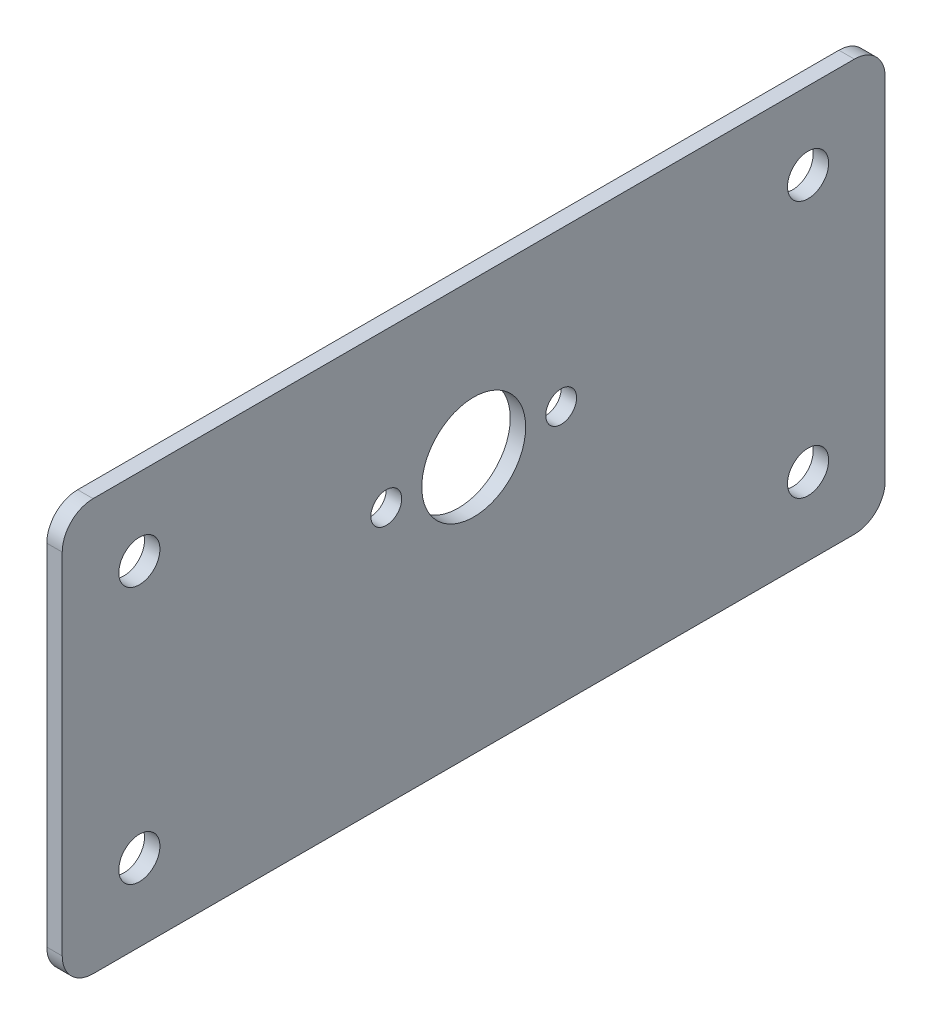
ISO-10303-21;
HEADER;
FILE_DESCRIPTION(('STEP AP214'),'2;1');
FILE_NAME('part.step','',(''),(''),'','','');
FILE_SCHEMA(('AUTOMOTIVE_DESIGN { 1 0 10303 214 1 1 1 1 }'));
ENDSEC;
DATA;
#1=APPLICATION_CONTEXT('core data for automotive mechanical design processes');
#2=APPLICATION_PROTOCOL_DEFINITION('international standard','automotive_design',2000,#1);
#3=PRODUCT_CONTEXT('',#1,'mechanical');
#4=PRODUCT('Part','Part','',(#3));
#5=PRODUCT_RELATED_PRODUCT_CATEGORY('part','',(#4));
#6=PRODUCT_DEFINITION_FORMATION('','',#4);
#7=PRODUCT_DEFINITION_CONTEXT('part definition',#1,'design');
#8=PRODUCT_DEFINITION('design','',#6,#7);
#9=PRODUCT_DEFINITION_SHAPE('','',#8);
#10=(LENGTH_UNIT() NAMED_UNIT(*) SI_UNIT(.MILLI.,.METRE.));
#11=(NAMED_UNIT(*) PLANE_ANGLE_UNIT() SI_UNIT($,.RADIAN.));
#12=(NAMED_UNIT(*) SI_UNIT($,.STERADIAN.) SOLID_ANGLE_UNIT());
#13=UNCERTAINTY_MEASURE_WITH_UNIT(LENGTH_MEASURE(1.E-05),#10,'distance_accuracy_value','');
#14=(GEOMETRIC_REPRESENTATION_CONTEXT(3) GLOBAL_UNCERTAINTY_ASSIGNED_CONTEXT((#13)) GLOBAL_UNIT_ASSIGNED_CONTEXT((#10,
#11,#12)) REPRESENTATION_CONTEXT('',''));
#15=CARTESIAN_POINT('',(0.,0.,0.));
#16=DIRECTION('',(0.,0.,1.));
#17=DIRECTION('',(1.,0.,0.));
#18=AXIS2_PLACEMENT_3D('',#15,#16,#17);
#19=CARTESIAN_POINT('',(1.5,0.,0.));
#20=DIRECTION('',(-1.,0.,0.));
#21=DIRECTION('',(0.,0.,1.));
#22=AXIS2_PLACEMENT_3D('',#19,#20,#21);
#23=PLANE('',#22);
#24=DIRECTION('',(0.,-1.,0.));
#25=VECTOR('',#24,1.);
#26=CARTESIAN_POINT('',(1.5,-20.,40.));
#27=LINE('',#26,#25);
#28=CARTESIAN_POINT('',(1.5,17.,40.));
#29=VERTEX_POINT('',#28);
#30=CARTESIAN_POINT('',(1.5,-17.,40.));
#31=VERTEX_POINT('',#30);
#32=EDGE_CURVE('E181',#29,#31,#27,.T.);
#33=ORIENTED_EDGE('',*,*,#32,.T.);
#34=CARTESIAN_POINT('',(1.5,-17.,37.));
#35=DIRECTION('',(-1.,0.,0.));
#36=DIRECTION('',(0.,0.,1.));
#37=AXIS2_PLACEMENT_3D('',#34,#35,#36);
#38=CIRCLE('',#37,3.);
#39=CARTESIAN_POINT('',(1.5,-20.,37.));
#40=VERTEX_POINT('',#39);
#41=EDGE_CURVE('E169',#31,#40,#38,.F.);
#42=ORIENTED_EDGE('',*,*,#41,.T.);
#43=DIRECTION('',(0.,0.,-1.));
#44=VECTOR('',#43,1.);
#45=CARTESIAN_POINT('',(1.5,-20.,40.));
#46=LINE('',#45,#44);
#47=CARTESIAN_POINT('',(1.5,-20.,-37.));
#48=VERTEX_POINT('',#47);
#49=EDGE_CURVE('E127',#40,#48,#46,.T.);
#50=ORIENTED_EDGE('',*,*,#49,.T.);
#51=CARTESIAN_POINT('',(1.5,-17.,-37.));
#52=DIRECTION('',(-1.,0.,0.));
#53=DIRECTION('',(0.,0.,1.));
#54=AXIS2_PLACEMENT_3D('',#51,#52,#53);
#55=CIRCLE('',#54,3.);
#56=CARTESIAN_POINT('',(1.5,-17.,-40.));
#57=VERTEX_POINT('',#56);
#58=EDGE_CURVE('E166',#48,#57,#55,.F.);
#59=ORIENTED_EDGE('',*,*,#58,.T.);
#60=DIRECTION('',(0.,1.,0.));
#61=VECTOR('',#60,1.);
#62=CARTESIAN_POINT('',(1.5,-20.,-40.));
#63=LINE('',#62,#61);
#64=CARTESIAN_POINT('',(1.5,17.,-40.));
#65=VERTEX_POINT('',#64);
#66=EDGE_CURVE('E136',#57,#65,#63,.T.);
#67=ORIENTED_EDGE('',*,*,#66,.T.);
#68=CARTESIAN_POINT('',(1.5,17.,-37.));
#69=DIRECTION('',(-1.,0.,0.));
#70=DIRECTION('',(0.,0.,1.));
#71=AXIS2_PLACEMENT_3D('',#68,#69,#70);
#72=CIRCLE('',#71,3.);
#73=CARTESIAN_POINT('',(1.5,20.,-37.));
#74=VERTEX_POINT('',#73);
#75=EDGE_CURVE('E61',#65,#74,#72,.F.);
#76=ORIENTED_EDGE('',*,*,#75,.T.);
#77=DIRECTION('',(0.,0.,1.));
#78=VECTOR('',#77,1.);
#79=CARTESIAN_POINT('',(1.5,20.,40.));
#80=LINE('',#79,#78);
#81=CARTESIAN_POINT('',(1.5,20.,37.));
#82=VERTEX_POINT('',#81);
#83=EDGE_CURVE('E141',#74,#82,#80,.T.);
#84=ORIENTED_EDGE('',*,*,#83,.T.);
#85=CARTESIAN_POINT('',(1.5,17.,37.));
#86=DIRECTION('',(-1.,0.,0.));
#87=DIRECTION('',(0.,0.,1.));
#88=AXIS2_PLACEMENT_3D('',#85,#86,#87);
#89=CIRCLE('',#88,3.);
#90=EDGE_CURVE('E161',#82,#29,#89,.F.);
#91=ORIENTED_EDGE('',*,*,#90,.T.);
#92=EDGE_LOOP('',(#33,#42,#50,#59,#67,#76,#84,#91));
#93=FACE_BOUND('',#92,.T.);
#94=CARTESIAN_POINT('',(1.5,-12.5,32.5));
#95=DIRECTION('',(1.,0.,0.));
#96=DIRECTION('',(0.,0.,1.));
#97=AXIS2_PLACEMENT_3D('',#94,#95,#96);
#98=CIRCLE('',#97,2.);
#99=CARTESIAN_POINT('',(1.5,-12.5,34.5));
#100=VERTEX_POINT('',#99);
#101=EDGE_CURVE('E193',#100,#100,#98,.T.);
#102=ORIENTED_EDGE('',*,*,#101,.F.);
#103=EDGE_LOOP('',(#102));
#104=FACE_BOUND('',#103,.T.);
#105=CARTESIAN_POINT('',(1.5,5.,-8.5));
#106=DIRECTION('',(1.,0.,0.));
#107=DIRECTION('',(0.,0.,-1.));
#108=AXIS2_PLACEMENT_3D('',#105,#106,#107);
#109=CIRCLE('',#108,1.5);
#110=CARTESIAN_POINT('',(1.5,5.,-10.));
#111=VERTEX_POINT('',#110);
#112=EDGE_CURVE('E299',#111,#111,#109,.T.);
#113=ORIENTED_EDGE('',*,*,#112,.F.);
#114=EDGE_LOOP('',(#113));
#115=FACE_BOUND('',#114,.T.);
#116=CARTESIAN_POINT('',(1.5,5.,8.5));
#117=DIRECTION('',(1.,0.,0.));
#118=DIRECTION('',(0.,0.,1.));
#119=AXIS2_PLACEMENT_3D('',#116,#117,#118);
#120=CIRCLE('',#119,1.5);
#121=CARTESIAN_POINT('',(1.5,5.,10.));
#122=VERTEX_POINT('',#121);
#123=EDGE_CURVE('E291',#122,#122,#120,.T.);
#124=ORIENTED_EDGE('',*,*,#123,.F.);
#125=EDGE_LOOP('',(#124));
#126=FACE_BOUND('',#125,.T.);
#127=CARTESIAN_POINT('',(1.5,5.00000000000001,0.));
#128=DIRECTION('',(1.,0.,0.));
#129=DIRECTION('',(0.,0.,-1.));
#130=AXIS2_PLACEMENT_3D('',#127,#128,#129);
#131=CIRCLE('',#130,5.05);
#132=CARTESIAN_POINT('',(1.5,5.00000000000001,-5.05));
#133=VERTEX_POINT('',#132);
#134=EDGE_CURVE('E283',#133,#133,#131,.T.);
#135=ORIENTED_EDGE('',*,*,#134,.F.);
#136=EDGE_LOOP('',(#135));
#137=FACE_BOUND('',#136,.T.);
#138=CARTESIAN_POINT('',(1.5,-12.5,-32.5));
#139=DIRECTION('',(1.,0.,0.));
#140=DIRECTION('',(0.,0.,-1.));
#141=AXIS2_PLACEMENT_3D('',#138,#139,#140);
#142=CIRCLE('',#141,2.);
#143=CARTESIAN_POINT('',(1.5,-12.5,-34.5));
#144=VERTEX_POINT('',#143);
#145=EDGE_CURVE('E275',#144,#144,#142,.T.);
#146=ORIENTED_EDGE('',*,*,#145,.F.);
#147=EDGE_LOOP('',(#146));
#148=FACE_BOUND('',#147,.T.);
#149=CARTESIAN_POINT('',(1.5,12.5,-32.5));
#150=DIRECTION('',(1.,0.,0.));
#151=DIRECTION('',(0.,0.,-1.));
#152=AXIS2_PLACEMENT_3D('',#149,#150,#151);
#153=CIRCLE('',#152,2.);
#154=CARTESIAN_POINT('',(1.5,12.5,-34.5));
#155=VERTEX_POINT('',#154);
#156=EDGE_CURVE('E267',#155,#155,#153,.T.);
#157=ORIENTED_EDGE('',*,*,#156,.F.);
#158=EDGE_LOOP('',(#157));
#159=FACE_BOUND('',#158,.T.);
#160=CARTESIAN_POINT('',(1.5,12.5,32.5));
#161=DIRECTION('',(1.,0.,0.));
#162=DIRECTION('',(0.,0.,1.));
#163=AXIS2_PLACEMENT_3D('',#160,#161,#162);
#164=CIRCLE('',#163,2.);
#165=CARTESIAN_POINT('',(1.5,12.5,34.5));
#166=VERTEX_POINT('',#165);
#167=EDGE_CURVE('E256',#166,#166,#164,.T.);
#168=ORIENTED_EDGE('',*,*,#167,.F.);
#169=EDGE_LOOP('',(#168));
#170=FACE_BOUND('',#169,.T.);
#171=ADVANCED_FACE('F39',(#93,#104,#115,#126,#137,#148,#159,#170),#23,.F.);
#172=CARTESIAN_POINT('',(0.,0.,0.));
#173=DIRECTION('',(-1.,0.,0.));
#174=DIRECTION('',(0.,0.,1.));
#175=AXIS2_PLACEMENT_3D('',#172,#173,#174);
#176=PLANE('',#175);
#177=CARTESIAN_POINT('',(0.,12.5,-32.5));
#178=DIRECTION('',(1.,0.,0.));
#179=DIRECTION('',(0.,0.,-1.));
#180=AXIS2_PLACEMENT_3D('',#177,#178,#179);
#181=CIRCLE('',#180,2.);
#182=CARTESIAN_POINT('',(0.,12.5,-34.5));
#183=VERTEX_POINT('',#182);
#184=EDGE_CURVE('E264',#183,#183,#181,.T.);
#185=ORIENTED_EDGE('',*,*,#184,.T.);
#186=EDGE_LOOP('',(#185));
#187=FACE_BOUND('',#186,.T.);
#188=CARTESIAN_POINT('',(0.,5.00000000000001,0.));
#189=DIRECTION('',(1.,0.,0.));
#190=DIRECTION('',(0.,0.,-1.));
#191=AXIS2_PLACEMENT_3D('',#188,#189,#190);
#192=CIRCLE('',#191,5.05);
#193=CARTESIAN_POINT('',(0.,5.00000000000001,-5.05));
#194=VERTEX_POINT('',#193);
#195=EDGE_CURVE('E279',#194,#194,#192,.T.);
#196=ORIENTED_EDGE('',*,*,#195,.T.);
#197=EDGE_LOOP('',(#196));
#198=FACE_BOUND('',#197,.T.);
#199=CARTESIAN_POINT('',(0.,5.,-8.5));
#200=DIRECTION('',(1.,0.,0.));
#201=DIRECTION('',(0.,0.,-1.));
#202=AXIS2_PLACEMENT_3D('',#199,#200,#201);
#203=CIRCLE('',#202,1.5);
#204=CARTESIAN_POINT('',(0.,5.,-10.));
#205=VERTEX_POINT('',#204);
#206=EDGE_CURVE('E295',#205,#205,#203,.T.);
#207=ORIENTED_EDGE('',*,*,#206,.T.);
#208=EDGE_LOOP('',(#207));
#209=FACE_BOUND('',#208,.T.);
#210=DIRECTION('',(0.,0.,-1.));
#211=VECTOR('',#210,1.);
#212=CARTESIAN_POINT('',(0.,-20.,40.));
#213=LINE('',#212,#211);
#214=CARTESIAN_POINT('',(0.,-20.,37.));
#215=VERTEX_POINT('',#214);
#216=CARTESIAN_POINT('',(0.,-20.,-37.));
#217=VERTEX_POINT('',#216);
#218=EDGE_CURVE('E124',#215,#217,#213,.T.);
#219=ORIENTED_EDGE('',*,*,#218,.F.);
#220=CARTESIAN_POINT('',(0.,-17.,37.));
#221=DIRECTION('',(-1.,0.,0.));
#222=DIRECTION('',(0.,0.,1.));
#223=AXIS2_PLACEMENT_3D('',#220,#221,#222);
#224=CIRCLE('',#223,3.);
#225=CARTESIAN_POINT('',(0.,-17.,40.));
#226=VERTEX_POINT('',#225);
#227=EDGE_CURVE('E106',#215,#226,#224,.T.);
#228=ORIENTED_EDGE('',*,*,#227,.T.);
#229=DIRECTION('',(0.,-1.,0.));
#230=VECTOR('',#229,1.);
#231=CARTESIAN_POINT('',(0.,-20.,40.));
#232=LINE('',#231,#230);
#233=CARTESIAN_POINT('',(0.,17.,40.));
#234=VERTEX_POINT('',#233);
#235=EDGE_CURVE('E137',#234,#226,#232,.T.);
#236=ORIENTED_EDGE('',*,*,#235,.F.);
#237=CARTESIAN_POINT('',(0.,17.,37.));
#238=DIRECTION('',(-1.,0.,0.));
#239=DIRECTION('',(0.,0.,1.));
#240=AXIS2_PLACEMENT_3D('',#237,#238,#239);
#241=CIRCLE('',#240,3.);
#242=CARTESIAN_POINT('',(0.,20.,37.));
#243=VERTEX_POINT('',#242);
#244=EDGE_CURVE('E129',#234,#243,#241,.T.);
#245=ORIENTED_EDGE('',*,*,#244,.T.);
#246=DIRECTION('',(0.,0.,1.));
#247=VECTOR('',#246,1.);
#248=CARTESIAN_POINT('',(0.,20.,40.));
#249=LINE('',#248,#247);
#250=CARTESIAN_POINT('',(0.,20.,-37.));
#251=VERTEX_POINT('',#250);
#252=EDGE_CURVE('E143',#251,#243,#249,.T.);
#253=ORIENTED_EDGE('',*,*,#252,.F.);
#254=CARTESIAN_POINT('',(0.,17.,-37.));
#255=DIRECTION('',(-1.,0.,0.));
#256=DIRECTION('',(0.,0.,1.));
#257=AXIS2_PLACEMENT_3D('',#254,#255,#256);
#258=CIRCLE('',#257,3.);
#259=CARTESIAN_POINT('',(0.,17.,-40.));
#260=VERTEX_POINT('',#259);
#261=EDGE_CURVE('E151',#251,#260,#258,.T.);
#262=ORIENTED_EDGE('',*,*,#261,.T.);
#263=DIRECTION('',(0.,1.,0.));
#264=VECTOR('',#263,1.);
#265=CARTESIAN_POINT('',(0.,-20.,-40.));
#266=LINE('',#265,#264);
#267=CARTESIAN_POINT('',(0.,-17.,-40.));
#268=VERTEX_POINT('',#267);
#269=EDGE_CURVE('E190',#268,#260,#266,.T.);
#270=ORIENTED_EDGE('',*,*,#269,.F.);
#271=CARTESIAN_POINT('',(0.,-17.,-37.));
#272=DIRECTION('',(-1.,0.,0.));
#273=DIRECTION('',(0.,0.,1.));
#274=AXIS2_PLACEMENT_3D('',#271,#272,#273);
#275=CIRCLE('',#274,3.);
#276=EDGE_CURVE('E118',#268,#217,#275,.T.);
#277=ORIENTED_EDGE('',*,*,#276,.T.);
#278=EDGE_LOOP('',(#219,#228,#236,#245,#253,#262,#270,#277));
#279=FACE_BOUND('',#278,.T.);
#280=CARTESIAN_POINT('',(0.,-12.5,32.5));
#281=DIRECTION('',(1.,0.,0.));
#282=DIRECTION('',(0.,0.,1.));
#283=AXIS2_PLACEMENT_3D('',#280,#281,#282);
#284=CIRCLE('',#283,2.);
#285=CARTESIAN_POINT('',(0.,-12.5,34.5));
#286=VERTEX_POINT('',#285);
#287=EDGE_CURVE('E303',#286,#286,#284,.T.);
#288=ORIENTED_EDGE('',*,*,#287,.T.);
#289=EDGE_LOOP('',(#288));
#290=FACE_BOUND('',#289,.T.);
#291=CARTESIAN_POINT('',(0.,5.,8.5));
#292=DIRECTION('',(1.,0.,0.));
#293=DIRECTION('',(0.,0.,1.));
#294=AXIS2_PLACEMENT_3D('',#291,#292,#293);
#295=CIRCLE('',#294,1.5);
#296=CARTESIAN_POINT('',(0.,5.,10.));
#297=VERTEX_POINT('',#296);
#298=EDGE_CURVE('E287',#297,#297,#295,.T.);
#299=ORIENTED_EDGE('',*,*,#298,.T.);
#300=EDGE_LOOP('',(#299));
#301=FACE_BOUND('',#300,.T.);
#302=CARTESIAN_POINT('',(0.,-12.5,-32.5));
#303=DIRECTION('',(1.,0.,0.));
#304=DIRECTION('',(0.,0.,-1.));
#305=AXIS2_PLACEMENT_3D('',#302,#303,#304);
#306=CIRCLE('',#305,2.);
#307=CARTESIAN_POINT('',(0.,-12.5,-34.5));
#308=VERTEX_POINT('',#307);
#309=EDGE_CURVE('E271',#308,#308,#306,.T.);
#310=ORIENTED_EDGE('',*,*,#309,.T.);
#311=EDGE_LOOP('',(#310));
#312=FACE_BOUND('',#311,.T.);
#313=CARTESIAN_POINT('',(0.,12.5,32.5));
#314=DIRECTION('',(1.,0.,0.));
#315=DIRECTION('',(0.,0.,1.));
#316=AXIS2_PLACEMENT_3D('',#313,#314,#315);
#317=CIRCLE('',#316,2.);
#318=CARTESIAN_POINT('',(0.,12.5,34.5));
#319=VERTEX_POINT('',#318);
#320=EDGE_CURVE('E259',#319,#319,#317,.T.);
#321=ORIENTED_EDGE('',*,*,#320,.T.);
#322=EDGE_LOOP('',(#321));
#323=FACE_BOUND('',#322,.T.);
#324=ADVANCED_FACE('F132',(#187,#198,#209,#279,#290,#301,#312,#323),#176,.T.);
#325=CARTESIAN_POINT('',(1.5,-20.,-40.));
#326=DIRECTION('',(0.,0.,1.));
#327=DIRECTION('',(1.,0.,0.));
#328=AXIS2_PLACEMENT_3D('',#325,#326,#327);
#329=PLANE('',#328);
#330=ORIENTED_EDGE('',*,*,#66,.F.);
#331=DIRECTION('',(-1.,0.,0.));
#332=VECTOR('',#331,1.);
#333=CARTESIAN_POINT('',(1.5,-17.,-40.));
#334=LINE('',#333,#332);
#335=EDGE_CURVE('E175',#57,#268,#334,.T.);
#336=ORIENTED_EDGE('',*,*,#335,.T.);
#337=ORIENTED_EDGE('',*,*,#269,.T.);
#338=DIRECTION('',(-1.,0.,0.));
#339=VECTOR('',#338,1.);
#340=CARTESIAN_POINT('',(1.5,17.,-40.));
#341=LINE('',#340,#339);
#342=EDGE_CURVE('E172',#260,#65,#341,.F.);
#343=ORIENTED_EDGE('',*,*,#342,.T.);
#344=EDGE_LOOP('',(#330,#336,#337,#343));
#345=FACE_BOUND('',#344,.T.);
#346=ADVANCED_FACE('F212',(#345),#329,.F.);
#347=CARTESIAN_POINT('',(1.5,20.,40.));
#348=DIRECTION('',(0.,-1.,0.));
#349=DIRECTION('',(0.,0.,-1.));
#350=AXIS2_PLACEMENT_3D('',#347,#348,#349);
#351=PLANE('',#350);
#352=ORIENTED_EDGE('',*,*,#83,.F.);
#353=DIRECTION('',(-1.,0.,0.));
#354=VECTOR('',#353,1.);
#355=CARTESIAN_POINT('',(1.5,20.,-37.));
#356=LINE('',#355,#354);
#357=EDGE_CURVE('E11',#74,#251,#356,.T.);
#358=ORIENTED_EDGE('',*,*,#357,.T.);
#359=ORIENTED_EDGE('',*,*,#252,.T.);
#360=DIRECTION('',(-1.,0.,0.));
#361=VECTOR('',#360,1.);
#362=CARTESIAN_POINT('',(1.5,20.,37.));
#363=LINE('',#362,#361);
#364=EDGE_CURVE('E48',#243,#82,#363,.F.);
#365=ORIENTED_EDGE('',*,*,#364,.T.);
#366=EDGE_LOOP('',(#352,#358,#359,#365));
#367=FACE_BOUND('',#366,.T.);
#368=ADVANCED_FACE('F196',(#367),#351,.F.);
#369=CARTESIAN_POINT('',(1.5,-20.,40.));
#370=DIRECTION('',(0.,0.,-1.));
#371=DIRECTION('',(-1.,0.,0.));
#372=AXIS2_PLACEMENT_3D('',#369,#370,#371);
#373=PLANE('',#372);
#374=ORIENTED_EDGE('',*,*,#235,.T.);
#375=DIRECTION('',(-1.,0.,0.));
#376=VECTOR('',#375,1.);
#377=CARTESIAN_POINT('',(1.5,-17.,40.));
#378=LINE('',#377,#376);
#379=EDGE_CURVE('E111',#226,#31,#378,.F.);
#380=ORIENTED_EDGE('',*,*,#379,.T.);
#381=ORIENTED_EDGE('',*,*,#32,.F.);
#382=DIRECTION('',(-1.,0.,0.));
#383=VECTOR('',#382,1.);
#384=CARTESIAN_POINT('',(1.5,17.,40.));
#385=LINE('',#384,#383);
#386=EDGE_CURVE('E117',#29,#234,#385,.T.);
#387=ORIENTED_EDGE('',*,*,#386,.T.);
#388=EDGE_LOOP('',(#374,#380,#381,#387));
#389=FACE_BOUND('',#388,.T.);
#390=ADVANCED_FACE('F203',(#389),#373,.F.);
#391=CARTESIAN_POINT('',(1.5,-20.,40.));
#392=DIRECTION('',(0.,1.,0.));
#393=DIRECTION('',(0.,0.,1.));
#394=AXIS2_PLACEMENT_3D('',#391,#392,#393);
#395=PLANE('',#394);
#396=ORIENTED_EDGE('',*,*,#49,.F.);
#397=DIRECTION('',(-1.,0.,0.));
#398=VECTOR('',#397,1.);
#399=CARTESIAN_POINT('',(1.5,-20.,37.));
#400=LINE('',#399,#398);
#401=EDGE_CURVE('E110',#40,#215,#400,.T.);
#402=ORIENTED_EDGE('',*,*,#401,.T.);
#403=ORIENTED_EDGE('',*,*,#218,.T.);
#404=DIRECTION('',(-1.,0.,0.));
#405=VECTOR('',#404,1.);
#406=CARTESIAN_POINT('',(1.5,-20.,-37.));
#407=LINE('',#406,#405);
#408=EDGE_CURVE('E130',#217,#48,#407,.F.);
#409=ORIENTED_EDGE('',*,*,#408,.T.);
#410=EDGE_LOOP('',(#396,#402,#403,#409));
#411=FACE_BOUND('',#410,.T.);
#412=ADVANCED_FACE('F123',(#411),#395,.F.);
#413=CARTESIAN_POINT('',(1.5,-12.5,32.5));
#414=DIRECTION('',(-1.,0.,0.));
#415=DIRECTION('',(0.,0.,1.));
#416=AXIS2_PLACEMENT_3D('',#413,#414,#415);
#417=CYLINDRICAL_SURFACE('',#416,2.);
#418=ORIENTED_EDGE('',*,*,#101,.T.);
#419=EDGE_LOOP('',(#418));
#420=FACE_BOUND('',#419,.T.);
#421=ORIENTED_EDGE('',*,*,#287,.F.);
#422=EDGE_LOOP('',(#421));
#423=FACE_BOUND('',#422,.T.);
#424=ADVANCED_FACE('F210',(#420,#423),#417,.F.);
#425=CARTESIAN_POINT('',(1.5,5.,-8.5));
#426=DIRECTION('',(-1.,0.,0.));
#427=DIRECTION('',(0.,0.,1.));
#428=AXIS2_PLACEMENT_3D('',#425,#426,#427);
#429=CYLINDRICAL_SURFACE('',#428,1.5);
#430=ORIENTED_EDGE('',*,*,#112,.T.);
#431=EDGE_LOOP('',(#430));
#432=FACE_BOUND('',#431,.T.);
#433=ORIENTED_EDGE('',*,*,#206,.F.);
#434=EDGE_LOOP('',(#433));
#435=FACE_BOUND('',#434,.T.);
#436=ADVANCED_FACE('F224',(#432,#435),#429,.F.);
#437=CARTESIAN_POINT('',(1.5,5.,8.5));
#438=DIRECTION('',(-1.,0.,0.));
#439=DIRECTION('',(0.,0.,1.));
#440=AXIS2_PLACEMENT_3D('',#437,#438,#439);
#441=CYLINDRICAL_SURFACE('',#440,1.5);
#442=ORIENTED_EDGE('',*,*,#123,.T.);
#443=EDGE_LOOP('',(#442));
#444=FACE_BOUND('',#443,.T.);
#445=ORIENTED_EDGE('',*,*,#298,.F.);
#446=EDGE_LOOP('',(#445));
#447=FACE_BOUND('',#446,.T.);
#448=ADVANCED_FACE('F228',(#444,#447),#441,.F.);
#449=CARTESIAN_POINT('',(1.5,5.00000000000001,0.));
#450=DIRECTION('',(-1.,0.,0.));
#451=DIRECTION('',(0.,0.,1.));
#452=AXIS2_PLACEMENT_3D('',#449,#450,#451);
#453=CYLINDRICAL_SURFACE('',#452,5.05);
#454=ORIENTED_EDGE('',*,*,#134,.T.);
#455=EDGE_LOOP('',(#454));
#456=FACE_BOUND('',#455,.T.);
#457=ORIENTED_EDGE('',*,*,#195,.F.);
#458=EDGE_LOOP('',(#457));
#459=FACE_BOUND('',#458,.T.);
#460=ADVANCED_FACE('F232',(#456,#459),#453,.F.);
#461=CARTESIAN_POINT('',(1.5,-12.5,-32.5));
#462=DIRECTION('',(-1.,0.,0.));
#463=DIRECTION('',(0.,0.,1.));
#464=AXIS2_PLACEMENT_3D('',#461,#462,#463);
#465=CYLINDRICAL_SURFACE('',#464,2.);
#466=ORIENTED_EDGE('',*,*,#145,.T.);
#467=EDGE_LOOP('',(#466));
#468=FACE_BOUND('',#467,.T.);
#469=ORIENTED_EDGE('',*,*,#309,.F.);
#470=EDGE_LOOP('',(#469));
#471=FACE_BOUND('',#470,.T.);
#472=ADVANCED_FACE('F236',(#468,#471),#465,.F.);
#473=CARTESIAN_POINT('',(1.5,12.5,-32.5));
#474=DIRECTION('',(-1.,0.,0.));
#475=DIRECTION('',(0.,0.,1.));
#476=AXIS2_PLACEMENT_3D('',#473,#474,#475);
#477=CYLINDRICAL_SURFACE('',#476,2.);
#478=ORIENTED_EDGE('',*,*,#156,.T.);
#479=EDGE_LOOP('',(#478));
#480=FACE_BOUND('',#479,.T.);
#481=ORIENTED_EDGE('',*,*,#184,.F.);
#482=EDGE_LOOP('',(#481));
#483=FACE_BOUND('',#482,.T.);
#484=ADVANCED_FACE('F240',(#480,#483),#477,.F.);
#485=CARTESIAN_POINT('',(1.5,12.5,32.5));
#486=DIRECTION('',(-1.,0.,0.));
#487=DIRECTION('',(0.,0.,1.));
#488=AXIS2_PLACEMENT_3D('',#485,#486,#487);
#489=CYLINDRICAL_SURFACE('',#488,2.);
#490=ORIENTED_EDGE('',*,*,#167,.T.);
#491=EDGE_LOOP('',(#490));
#492=FACE_BOUND('',#491,.T.);
#493=ORIENTED_EDGE('',*,*,#320,.F.);
#494=EDGE_LOOP('',(#493));
#495=FACE_BOUND('',#494,.T.);
#496=ADVANCED_FACE('F244',(#492,#495),#489,.F.);
#497=CARTESIAN_POINT('',(1.5,-17.,37.));
#498=DIRECTION('',(-1.,0.,0.));
#499=DIRECTION('',(0.,0.,1.));
#500=AXIS2_PLACEMENT_3D('',#497,#498,#499);
#501=CYLINDRICAL_SURFACE('',#500,3.);
#502=ORIENTED_EDGE('',*,*,#41,.F.);
#503=ORIENTED_EDGE('',*,*,#379,.F.);
#504=ORIENTED_EDGE('',*,*,#227,.F.);
#505=ORIENTED_EDGE('',*,*,#401,.F.);
#506=EDGE_LOOP('',(#502,#503,#504,#505));
#507=FACE_BOUND('',#506,.T.);
#508=ADVANCED_FACE('F109',(#507),#501,.T.);
#509=CARTESIAN_POINT('',(1.5,-17.,-37.));
#510=DIRECTION('',(-1.,0.,0.));
#511=DIRECTION('',(0.,0.,1.));
#512=AXIS2_PLACEMENT_3D('',#509,#510,#511);
#513=CYLINDRICAL_SURFACE('',#512,3.);
#514=ORIENTED_EDGE('',*,*,#58,.F.);
#515=ORIENTED_EDGE('',*,*,#408,.F.);
#516=ORIENTED_EDGE('',*,*,#276,.F.);
#517=ORIENTED_EDGE('',*,*,#335,.F.);
#518=EDGE_LOOP('',(#514,#515,#516,#517));
#519=FACE_BOUND('',#518,.T.);
#520=ADVANCED_FACE('F251',(#519),#513,.T.);
#521=CARTESIAN_POINT('',(1.5,17.,-37.));
#522=DIRECTION('',(-1.,0.,0.));
#523=DIRECTION('',(0.,0.,1.));
#524=AXIS2_PLACEMENT_3D('',#521,#522,#523);
#525=CYLINDRICAL_SURFACE('',#524,3.);
#526=ORIENTED_EDGE('',*,*,#75,.F.);
#527=ORIENTED_EDGE('',*,*,#342,.F.);
#528=ORIENTED_EDGE('',*,*,#261,.F.);
#529=ORIENTED_EDGE('',*,*,#357,.F.);
#530=EDGE_LOOP('',(#526,#527,#528,#529));
#531=FACE_BOUND('',#530,.T.);
#532=ADVANCED_FACE('F342',(#531),#525,.T.);
#533=CARTESIAN_POINT('',(1.5,17.,37.));
#534=DIRECTION('',(-1.,0.,0.));
#535=DIRECTION('',(0.,0.,1.));
#536=AXIS2_PLACEMENT_3D('',#533,#534,#535);
#537=CYLINDRICAL_SURFACE('',#536,3.);
#538=ORIENTED_EDGE('',*,*,#90,.F.);
#539=ORIENTED_EDGE('',*,*,#364,.F.);
#540=ORIENTED_EDGE('',*,*,#244,.F.);
#541=ORIENTED_EDGE('',*,*,#386,.F.);
#542=EDGE_LOOP('',(#538,#539,#540,#541));
#543=FACE_BOUND('',#542,.T.);
#544=ADVANCED_FACE('F41',(#543),#537,.T.);
#545=CLOSED_SHELL('',(#171,#324,#346,#368,#390,#412,#424,#436,#448,#460,#472,#484,#496,#508,
#520,#532,#544));
#546=MANIFOLD_SOLID_BREP('B2',#545);
#547=ADVANCED_BREP_SHAPE_REPRESENTATION('',(#18,#546),#14);
#548=SHAPE_DEFINITION_REPRESENTATION(#9,#547);
ENDSEC;
END-ISO-10303-21;
